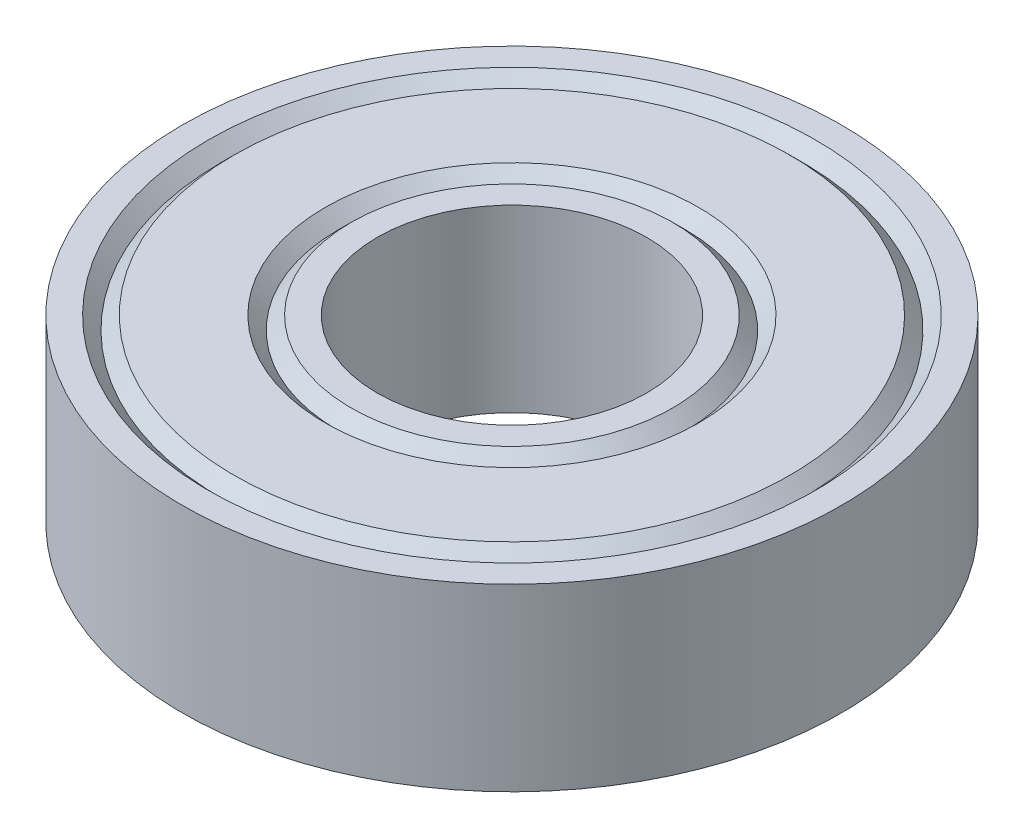
ISO-10303-21;
HEADER;
FILE_DESCRIPTION(('STEP AP214'),'2;1');
FILE_NAME('part.step','',(''),(''),'','','');
FILE_SCHEMA(('AUTOMOTIVE_DESIGN { 1 0 10303 214 1 1 1 1 }'));
ENDSEC;
DATA;
#1=APPLICATION_CONTEXT('core data for automotive mechanical design processes');
#2=APPLICATION_PROTOCOL_DEFINITION('international standard','automotive_design',2000,#1);
#3=PRODUCT_CONTEXT('',#1,'mechanical');
#4=PRODUCT('Part','Part','',(#3));
#5=PRODUCT_RELATED_PRODUCT_CATEGORY('part','',(#4));
#6=PRODUCT_DEFINITION_FORMATION('','',#4);
#7=PRODUCT_DEFINITION_CONTEXT('part definition',#1,'design');
#8=PRODUCT_DEFINITION('design','',#6,#7);
#9=PRODUCT_DEFINITION_SHAPE('','',#8);
#10=(LENGTH_UNIT() NAMED_UNIT(*) SI_UNIT(.MILLI.,.METRE.));
#11=(NAMED_UNIT(*) PLANE_ANGLE_UNIT() SI_UNIT($,.RADIAN.));
#12=(NAMED_UNIT(*) SI_UNIT($,.STERADIAN.) SOLID_ANGLE_UNIT());
#13=UNCERTAINTY_MEASURE_WITH_UNIT(LENGTH_MEASURE(1.E-05),#10,'distance_accuracy_value','');
#14=(GEOMETRIC_REPRESENTATION_CONTEXT(3) GLOBAL_UNCERTAINTY_ASSIGNED_CONTEXT((#13)) GLOBAL_UNIT_ASSIGNED_CONTEXT((#10,
#11,#12)) REPRESENTATION_CONTEXT('',''));
#15=CARTESIAN_POINT('',(0.,0.,0.));
#16=DIRECTION('',(0.,0.,1.));
#17=DIRECTION('',(1.,0.,0.));
#18=AXIS2_PLACEMENT_3D('',#15,#16,#17);
#19=CARTESIAN_POINT('',(0.,3.,0.));
#20=DIRECTION('',(0.,1.,0.));
#21=DIRECTION('',(-1.,0.,0.));
#22=AXIS2_PLACEMENT_3D('',#19,#20,#21);
#23=CYLINDRICAL_SURFACE('',#22,4.5);
#24=CARTESIAN_POINT('',(0.,3.,0.));
#25=DIRECTION('',(0.,1.,0.));
#26=DIRECTION('',(-1.,0.,0.));
#27=AXIS2_PLACEMENT_3D('',#24,#25,#26);
#28=CIRCLE('',#27,4.5);
#29=CARTESIAN_POINT('',(-4.5,3.,0.));
#30=VERTEX_POINT('',#29);
#31=EDGE_CURVE('E83',#30,#30,#28,.T.);
#32=ORIENTED_EDGE('',*,*,#31,.T.);
#33=EDGE_LOOP('',(#32));
#34=FACE_BOUND('',#33,.T.);
#35=CARTESIAN_POINT('',(0.,-3.,0.));
#36=DIRECTION('',(0.,1.,0.));
#37=DIRECTION('',(-1.,0.,0.));
#38=AXIS2_PLACEMENT_3D('',#35,#36,#37);
#39=CIRCLE('',#38,4.5);
#40=CARTESIAN_POINT('',(-4.5,-3.,0.));
#41=VERTEX_POINT('',#40);
#42=EDGE_CURVE('E10',#41,#41,#39,.T.);
#43=ORIENTED_EDGE('',*,*,#42,.F.);
#44=EDGE_LOOP('',(#43));
#45=FACE_BOUND('',#44,.T.);
#46=ADVANCED_FACE('F31',(#34,#45),#23,.F.);
#47=CARTESIAN_POINT('',(-4.5,-3.,0.));
#48=DIRECTION('',(0.,-1.,0.));
#49=DIRECTION('',(1.,0.,0.));
#50=AXIS2_PLACEMENT_3D('',#47,#48,#49);
#51=PLANE('',#50);
#52=ORIENTED_EDGE('',*,*,#42,.T.);
#53=EDGE_LOOP('',(#52));
#54=FACE_BOUND('',#53,.T.);
#55=CARTESIAN_POINT('',(0.,-3.,0.));
#56=DIRECTION('',(0.,1.,0.));
#57=DIRECTION('',(-1.,0.,0.));
#58=AXIS2_PLACEMENT_3D('',#55,#56,#57);
#59=CIRCLE('',#58,5.36666666666667);
#60=CARTESIAN_POINT('',(-5.36666666666667,-3.,0.));
#61=VERTEX_POINT('',#60);
#62=EDGE_CURVE('E37',#61,#61,#59,.T.);
#63=ORIENTED_EDGE('',*,*,#62,.F.);
#64=EDGE_LOOP('',(#63));
#65=FACE_BOUND('',#64,.T.);
#66=ADVANCED_FACE('F101',(#54,#65),#51,.T.);
#67=CARTESIAN_POINT('',(0.,-2.56666666666667,0.));
#68=DIRECTION('',(0.,1.,0.));
#69=DIRECTION('',(-1.,0.,0.));
#70=AXIS2_PLACEMENT_3D('',#67,#68,#69);
#71=CONICAL_SURFACE('',#70,5.80000000000001,0.785398163397448);
#72=ORIENTED_EDGE('',*,*,#62,.T.);
#73=EDGE_LOOP('',(#72));
#74=FACE_BOUND('',#73,.T.);
#75=CARTESIAN_POINT('',(0.,-2.56666666666667,0.));
#76=DIRECTION('',(0.,1.,0.));
#77=DIRECTION('',(-1.,0.,0.));
#78=AXIS2_PLACEMENT_3D('',#75,#76,#77);
#79=CIRCLE('',#78,5.80000000000001);
#80=CARTESIAN_POINT('',(-5.80000000000001,-2.56666666666666,0.));
#81=VERTEX_POINT('',#80);
#82=EDGE_CURVE('E41',#81,#81,#79,.T.);
#83=ORIENTED_EDGE('',*,*,#82,.F.);
#84=EDGE_LOOP('',(#83));
#85=FACE_BOUND('',#84,.T.);
#86=ADVANCED_FACE('F105',(#74,#85),#71,.T.);
#87=CARTESIAN_POINT('',(0.,-3.,0.));
#88=DIRECTION('',(0.,-1.,0.));
#89=DIRECTION('',(1.,0.,0.));
#90=AXIS2_PLACEMENT_3D('',#87,#88,#89);
#91=CONICAL_SURFACE('',#90,6.23333333333334,0.785398163397447);
#92=ORIENTED_EDGE('',*,*,#82,.T.);
#93=EDGE_LOOP('',(#92));
#94=FACE_BOUND('',#93,.T.);
#95=CARTESIAN_POINT('',(0.,-3.,0.));
#96=DIRECTION('',(0.,1.,0.));
#97=DIRECTION('',(-1.,0.,0.));
#98=AXIS2_PLACEMENT_3D('',#95,#96,#97);
#99=CIRCLE('',#98,6.23333333333334);
#100=CARTESIAN_POINT('',(-6.23333333333334,-3.,0.));
#101=VERTEX_POINT('',#100);
#102=EDGE_CURVE('E45',#101,#101,#99,.T.);
#103=ORIENTED_EDGE('',*,*,#102,.F.);
#104=EDGE_LOOP('',(#103));
#105=FACE_BOUND('',#104,.T.);
#106=ADVANCED_FACE('F109',(#94,#105),#91,.F.);
#107=CARTESIAN_POINT('',(-6.23333333333334,-3.,0.));
#108=DIRECTION('',(0.,-1.,0.));
#109=DIRECTION('',(1.,0.,0.));
#110=AXIS2_PLACEMENT_3D('',#107,#108,#109);
#111=PLANE('',#110);
#112=ORIENTED_EDGE('',*,*,#102,.T.);
#113=EDGE_LOOP('',(#112));
#114=FACE_BOUND('',#113,.T.);
#115=CARTESIAN_POINT('',(0.,-3.00000000000001,0.));
#116=DIRECTION('',(0.,1.,0.));
#117=DIRECTION('',(-1.,0.,0.));
#118=AXIS2_PLACEMENT_3D('',#115,#116,#117);
#119=CIRCLE('',#118,9.26666666666666);
#120=CARTESIAN_POINT('',(-9.26666666666666,-3.00000000000001,0.));
#121=VERTEX_POINT('',#120);
#122=EDGE_CURVE('E50',#121,#121,#119,.T.);
#123=ORIENTED_EDGE('',*,*,#122,.F.);
#124=EDGE_LOOP('',(#123));
#125=FACE_BOUND('',#124,.T.);
#126=ADVANCED_FACE('F115',(#114,#125),#111,.T.);
#127=CARTESIAN_POINT('',(0.,-2.56666666666667,0.));
#128=DIRECTION('',(0.,1.,0.));
#129=DIRECTION('',(-1.,0.,0.));
#130=AXIS2_PLACEMENT_3D('',#127,#128,#129);
#131=CONICAL_SURFACE('',#130,9.7,0.785398163397441);
#132=ORIENTED_EDGE('',*,*,#122,.T.);
#133=EDGE_LOOP('',(#132));
#134=FACE_BOUND('',#133,.T.);
#135=CARTESIAN_POINT('',(0.,-2.56666666666667,0.));
#136=DIRECTION('',(0.,1.,0.));
#137=DIRECTION('',(-1.,0.,0.));
#138=AXIS2_PLACEMENT_3D('',#135,#136,#137);
#139=CIRCLE('',#138,9.7);
#140=CARTESIAN_POINT('',(-9.7,-2.56666666666667,0.));
#141=VERTEX_POINT('',#140);
#142=EDGE_CURVE('E53',#141,#141,#139,.T.);
#143=ORIENTED_EDGE('',*,*,#142,.F.);
#144=EDGE_LOOP('',(#143));
#145=FACE_BOUND('',#144,.T.);
#146=ADVANCED_FACE('F119',(#134,#145),#131,.T.);
#147=CARTESIAN_POINT('',(0.,-3.,0.));
#148=DIRECTION('',(0.,-1.,0.));
#149=DIRECTION('',(1.,0.,0.));
#150=AXIS2_PLACEMENT_3D('',#147,#148,#149);
#151=CONICAL_SURFACE('',#150,10.1333333333333,0.785398163397446);
#152=ORIENTED_EDGE('',*,*,#142,.T.);
#153=EDGE_LOOP('',(#152));
#154=FACE_BOUND('',#153,.T.);
#155=CARTESIAN_POINT('',(0.,-3.,0.));
#156=DIRECTION('',(0.,1.,0.));
#157=DIRECTION('',(-1.,0.,0.));
#158=AXIS2_PLACEMENT_3D('',#155,#156,#157);
#159=CIRCLE('',#158,10.1333333333333);
#160=CARTESIAN_POINT('',(-10.1333333333333,-3.,0.));
#161=VERTEX_POINT('',#160);
#162=EDGE_CURVE('E56',#161,#161,#159,.T.);
#163=ORIENTED_EDGE('',*,*,#162,.F.);
#164=EDGE_LOOP('',(#163));
#165=FACE_BOUND('',#164,.T.);
#166=ADVANCED_FACE('F123',(#154,#165),#151,.F.);
#167=CARTESIAN_POINT('',(-10.1333333333333,-3.,0.));
#168=DIRECTION('',(0.,-1.,0.));
#169=DIRECTION('',(1.,0.,0.));
#170=AXIS2_PLACEMENT_3D('',#167,#168,#169);
#171=PLANE('',#170);
#172=ORIENTED_EDGE('',*,*,#162,.T.);
#173=EDGE_LOOP('',(#172));
#174=FACE_BOUND('',#173,.T.);
#175=CARTESIAN_POINT('',(0.,-3.,0.));
#176=DIRECTION('',(0.,1.,0.));
#177=DIRECTION('',(-1.,0.,0.));
#178=AXIS2_PLACEMENT_3D('',#175,#176,#177);
#179=CIRCLE('',#178,11.);
#180=CARTESIAN_POINT('',(-11.,-3.,0.));
#181=VERTEX_POINT('',#180);
#182=EDGE_CURVE('E59',#181,#181,#179,.T.);
#183=ORIENTED_EDGE('',*,*,#182,.F.);
#184=EDGE_LOOP('',(#183));
#185=FACE_BOUND('',#184,.T.);
#186=ADVANCED_FACE('F127',(#174,#185),#171,.T.);
#187=CARTESIAN_POINT('',(0.,3.,0.));
#188=DIRECTION('',(0.,1.,0.));
#189=DIRECTION('',(-1.,0.,0.));
#190=AXIS2_PLACEMENT_3D('',#187,#188,#189);
#191=CYLINDRICAL_SURFACE('',#190,11.);
#192=ORIENTED_EDGE('',*,*,#182,.T.);
#193=EDGE_LOOP('',(#192));
#194=FACE_BOUND('',#193,.T.);
#195=CARTESIAN_POINT('',(0.,3.,0.));
#196=DIRECTION('',(0.,1.,0.));
#197=DIRECTION('',(-1.,0.,0.));
#198=AXIS2_PLACEMENT_3D('',#195,#196,#197);
#199=CIRCLE('',#198,11.);
#200=CARTESIAN_POINT('',(-11.,3.,0.));
#201=VERTEX_POINT('',#200);
#202=EDGE_CURVE('E62',#201,#201,#199,.T.);
#203=ORIENTED_EDGE('',*,*,#202,.F.);
#204=EDGE_LOOP('',(#203));
#205=FACE_BOUND('',#204,.T.);
#206=ADVANCED_FACE('F131',(#194,#205),#191,.T.);
#207=CARTESIAN_POINT('',(-10.1333333333333,3.,0.));
#208=DIRECTION('',(0.,1.,0.));
#209=DIRECTION('',(-1.,0.,0.));
#210=AXIS2_PLACEMENT_3D('',#207,#208,#209);
#211=PLANE('',#210);
#212=ORIENTED_EDGE('',*,*,#202,.T.);
#213=EDGE_LOOP('',(#212));
#214=FACE_BOUND('',#213,.T.);
#215=CARTESIAN_POINT('',(0.,3.,0.));
#216=DIRECTION('',(0.,1.,0.));
#217=DIRECTION('',(-1.,0.,0.));
#218=AXIS2_PLACEMENT_3D('',#215,#216,#217);
#219=CIRCLE('',#218,10.1333333333333);
#220=CARTESIAN_POINT('',(-10.1333333333333,3.,0.));
#221=VERTEX_POINT('',#220);
#222=EDGE_CURVE('E65',#221,#221,#219,.T.);
#223=ORIENTED_EDGE('',*,*,#222,.F.);
#224=EDGE_LOOP('',(#223));
#225=FACE_BOUND('',#224,.T.);
#226=ADVANCED_FACE('F135',(#214,#225),#211,.T.);
#227=CARTESIAN_POINT('',(0.,2.56666666666666,0.));
#228=DIRECTION('',(0.,1.,0.));
#229=DIRECTION('',(-1.,0.,0.));
#230=AXIS2_PLACEMENT_3D('',#227,#228,#229);
#231=CONICAL_SURFACE('',#230,9.7,0.785398163397437);
#232=ORIENTED_EDGE('',*,*,#222,.T.);
#233=EDGE_LOOP('',(#232));
#234=FACE_BOUND('',#233,.T.);
#235=CARTESIAN_POINT('',(0.,2.56666666666666,0.));
#236=DIRECTION('',(0.,1.,0.));
#237=DIRECTION('',(-1.,0.,0.));
#238=AXIS2_PLACEMENT_3D('',#235,#236,#237);
#239=CIRCLE('',#238,9.7);
#240=CARTESIAN_POINT('',(-9.7,2.56666666666667,0.));
#241=VERTEX_POINT('',#240);
#242=EDGE_CURVE('E68',#241,#241,#239,.T.);
#243=ORIENTED_EDGE('',*,*,#242,.F.);
#244=EDGE_LOOP('',(#243));
#245=FACE_BOUND('',#244,.T.);
#246=ADVANCED_FACE('F139',(#234,#245),#231,.F.);
#247=CARTESIAN_POINT('',(0.,3.,0.));
#248=DIRECTION('',(0.,-1.,0.));
#249=DIRECTION('',(1.,0.,0.));
#250=AXIS2_PLACEMENT_3D('',#247,#248,#249);
#251=CONICAL_SURFACE('',#250,9.26666666666666,0.785398163397451);
#252=ORIENTED_EDGE('',*,*,#242,.T.);
#253=EDGE_LOOP('',(#252));
#254=FACE_BOUND('',#253,.T.);
#255=CARTESIAN_POINT('',(0.,3.,0.));
#256=DIRECTION('',(0.,1.,0.));
#257=DIRECTION('',(-1.,0.,0.));
#258=AXIS2_PLACEMENT_3D('',#255,#256,#257);
#259=CIRCLE('',#258,9.26666666666666);
#260=CARTESIAN_POINT('',(-9.26666666666666,3.00000000000001,0.));
#261=VERTEX_POINT('',#260);
#262=EDGE_CURVE('E71',#261,#261,#259,.T.);
#263=ORIENTED_EDGE('',*,*,#262,.F.);
#264=EDGE_LOOP('',(#263));
#265=FACE_BOUND('',#264,.T.);
#266=ADVANCED_FACE('F143',(#254,#265),#251,.T.);
#267=CARTESIAN_POINT('',(-6.23333333333334,3.,0.));
#268=DIRECTION('',(0.,1.,0.));
#269=DIRECTION('',(-1.,0.,0.));
#270=AXIS2_PLACEMENT_3D('',#267,#268,#269);
#271=PLANE('',#270);
#272=ORIENTED_EDGE('',*,*,#262,.T.);
#273=EDGE_LOOP('',(#272));
#274=FACE_BOUND('',#273,.T.);
#275=CARTESIAN_POINT('',(0.,3.,0.));
#276=DIRECTION('',(0.,1.,0.));
#277=DIRECTION('',(-1.,0.,0.));
#278=AXIS2_PLACEMENT_3D('',#275,#276,#277);
#279=CIRCLE('',#278,6.23333333333334);
#280=CARTESIAN_POINT('',(-6.23333333333334,3.,0.));
#281=VERTEX_POINT('',#280);
#282=EDGE_CURVE('E74',#281,#281,#279,.T.);
#283=ORIENTED_EDGE('',*,*,#282,.F.);
#284=EDGE_LOOP('',(#283));
#285=FACE_BOUND('',#284,.T.);
#286=ADVANCED_FACE('F147',(#274,#285),#271,.T.);
#287=CARTESIAN_POINT('',(0.,2.56666666666666,0.));
#288=DIRECTION('',(0.,1.,0.));
#289=DIRECTION('',(-1.,0.,0.));
#290=AXIS2_PLACEMENT_3D('',#287,#288,#289);
#291=CONICAL_SURFACE('',#290,5.80000000000001,0.785398163397449);
#292=ORIENTED_EDGE('',*,*,#282,.T.);
#293=EDGE_LOOP('',(#292));
#294=FACE_BOUND('',#293,.T.);
#295=CARTESIAN_POINT('',(0.,2.56666666666666,0.));
#296=DIRECTION('',(0.,1.,0.));
#297=DIRECTION('',(-1.,0.,0.));
#298=AXIS2_PLACEMENT_3D('',#295,#296,#297);
#299=CIRCLE('',#298,5.80000000000001);
#300=CARTESIAN_POINT('',(-5.80000000000001,2.56666666666666,0.));
#301=VERTEX_POINT('',#300);
#302=EDGE_CURVE('E77',#301,#301,#299,.T.);
#303=ORIENTED_EDGE('',*,*,#302,.F.);
#304=EDGE_LOOP('',(#303));
#305=FACE_BOUND('',#304,.T.);
#306=ADVANCED_FACE('F97',(#294,#305),#291,.F.);
#307=CARTESIAN_POINT('',(0.,3.,0.));
#308=DIRECTION('',(0.,-1.,0.));
#309=DIRECTION('',(1.,0.,0.));
#310=AXIS2_PLACEMENT_3D('',#307,#308,#309);
#311=CONICAL_SURFACE('',#310,5.36666666666668,0.785398163397446);
#312=ORIENTED_EDGE('',*,*,#302,.T.);
#313=EDGE_LOOP('',(#312));
#314=FACE_BOUND('',#313,.T.);
#315=CARTESIAN_POINT('',(0.,3.,0.));
#316=DIRECTION('',(0.,1.,0.));
#317=DIRECTION('',(-1.,0.,0.));
#318=AXIS2_PLACEMENT_3D('',#315,#316,#317);
#319=CIRCLE('',#318,5.36666666666668);
#320=CARTESIAN_POINT('',(-5.36666666666667,3.,0.));
#321=VERTEX_POINT('',#320);
#322=EDGE_CURVE('E80',#321,#321,#319,.T.);
#323=ORIENTED_EDGE('',*,*,#322,.F.);
#324=EDGE_LOOP('',(#323));
#325=FACE_BOUND('',#324,.T.);
#326=ADVANCED_FACE('F91',(#314,#325),#311,.T.);
#327=CARTESIAN_POINT('',(-4.5,3.,0.));
#328=DIRECTION('',(0.,1.,0.));
#329=DIRECTION('',(-1.,0.,0.));
#330=AXIS2_PLACEMENT_3D('',#327,#328,#329);
#331=PLANE('',#330);
#332=ORIENTED_EDGE('',*,*,#322,.T.);
#333=EDGE_LOOP('',(#332));
#334=FACE_BOUND('',#333,.T.);
#335=ORIENTED_EDGE('',*,*,#31,.F.);
#336=EDGE_LOOP('',(#335));
#337=FACE_BOUND('',#336,.T.);
#338=ADVANCED_FACE('F89',(#334,#337),#331,.T.);
#339=CLOSED_SHELL('',(#46,#66,#86,#106,#126,#146,#166,#186,#206,#226,#246,#266,#286,#306,#326,#338));
#340=MANIFOLD_SOLID_BREP('B2',#339);
#341=ADVANCED_BREP_SHAPE_REPRESENTATION('',(#18,#340),#14);
#342=SHAPE_DEFINITION_REPRESENTATION(#9,#341);
ENDSEC;
END-ISO-10303-21;
